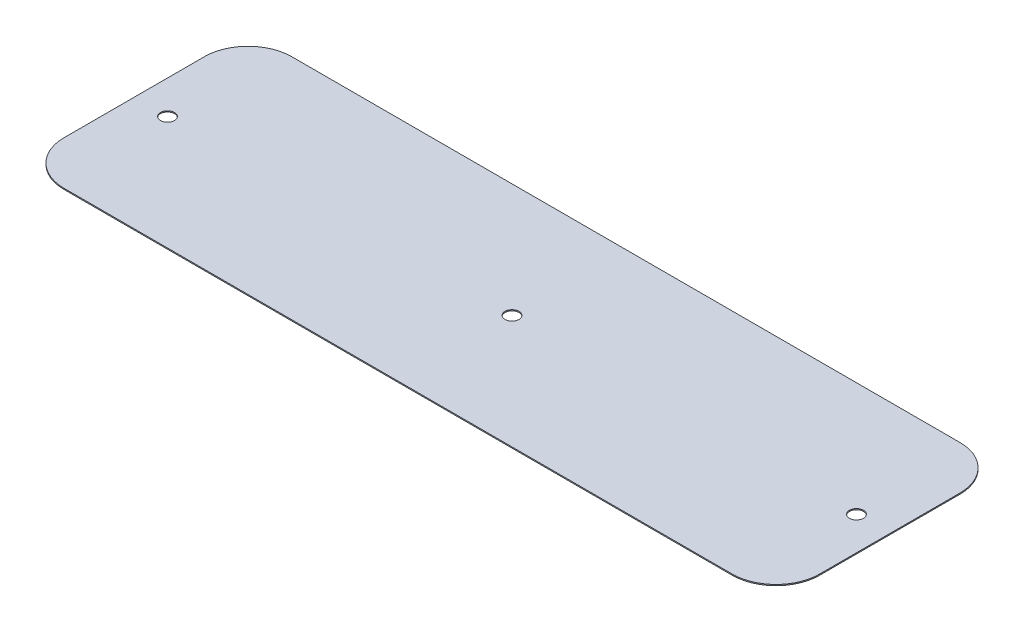
ISO-10303-21;
HEADER;
FILE_DESCRIPTION(('STEP AP214'),'2;1');
FILE_NAME('part.step','',(''),(''),'','','');
FILE_SCHEMA(('AUTOMOTIVE_DESIGN { 1 0 10303 214 1 1 1 1 }'));
ENDSEC;
DATA;
#1=APPLICATION_CONTEXT('core data for automotive mechanical design processes');
#2=APPLICATION_PROTOCOL_DEFINITION('international standard','automotive_design',2000,#1);
#3=PRODUCT_CONTEXT('',#1,'mechanical');
#4=PRODUCT('Part','Part','',(#3));
#5=PRODUCT_RELATED_PRODUCT_CATEGORY('part','',(#4));
#6=PRODUCT_DEFINITION_FORMATION('','',#4);
#7=PRODUCT_DEFINITION_CONTEXT('part definition',#1,'design');
#8=PRODUCT_DEFINITION('design','',#6,#7);
#9=PRODUCT_DEFINITION_SHAPE('','',#8);
#10=(LENGTH_UNIT() NAMED_UNIT(*) SI_UNIT(.MILLI.,.METRE.));
#11=(NAMED_UNIT(*) PLANE_ANGLE_UNIT() SI_UNIT($,.RADIAN.));
#12=(NAMED_UNIT(*) SI_UNIT($,.STERADIAN.) SOLID_ANGLE_UNIT());
#13=UNCERTAINTY_MEASURE_WITH_UNIT(LENGTH_MEASURE(1.E-05),#10,'distance_accuracy_value','');
#14=(GEOMETRIC_REPRESENTATION_CONTEXT(3) GLOBAL_UNCERTAINTY_ASSIGNED_CONTEXT((#13)) GLOBAL_UNIT_ASSIGNED_CONTEXT((#10,
#11,#12)) REPRESENTATION_CONTEXT('',''));
#15=CARTESIAN_POINT('',(0.,0.,0.));
#16=DIRECTION('',(0.,0.,1.));
#17=DIRECTION('',(1.,0.,0.));
#18=AXIS2_PLACEMENT_3D('',#15,#16,#17);
#19=CARTESIAN_POINT('',(0.,0.25,0.));
#20=DIRECTION('',(0.,-1.,0.));
#21=DIRECTION('',(0.,0.,-1.));
#22=AXIS2_PLACEMENT_3D('',#19,#20,#21);
#23=PLANE('',#22);
#24=CARTESIAN_POINT('',(-78.74,0.25,0.));
#25=DIRECTION('',(0.,1.,0.));
#26=DIRECTION('',(0.,0.,1.));
#27=AXIS2_PLACEMENT_3D('',#24,#25,#26);
#28=CIRCLE('',#27,1.60000000000001);
#29=CARTESIAN_POINT('',(-78.74,0.25,1.60000000000001));
#30=VERTEX_POINT('',#29);
#31=EDGE_CURVE('E194',#30,#30,#28,.T.);
#32=ORIENTED_EDGE('',*,*,#31,.F.);
#33=EDGE_LOOP('',(#32));
#34=FACE_BOUND('',#33,.T.);
#35=CARTESIAN_POINT('',(0.,0.25,0.));
#36=DIRECTION('',(0.,1.,0.));
#37=DIRECTION('',(0.,0.,1.));
#38=AXIS2_PLACEMENT_3D('',#35,#36,#37);
#39=CIRCLE('',#38,1.6);
#40=CARTESIAN_POINT('',(0.,0.25,1.6));
#41=VERTEX_POINT('',#40);
#42=EDGE_CURVE('E199',#41,#41,#39,.T.);
#43=ORIENTED_EDGE('',*,*,#42,.F.);
#44=EDGE_LOOP('',(#43));
#45=FACE_BOUND('',#44,.T.);
#46=DIRECTION('',(-1.,0.,0.));
#47=VECTOR('',#46,1.);
#48=CARTESIAN_POINT('',(-86.36,0.25,-26.035));
#49=LINE('',#48,#47);
#50=CARTESIAN_POINT('',(76.36,0.25,-26.035));
#51=VERTEX_POINT('',#50);
#52=CARTESIAN_POINT('',(-76.36,0.25,-26.035));
#53=VERTEX_POINT('',#52);
#54=EDGE_CURVE('E183',#51,#53,#49,.T.);
#55=ORIENTED_EDGE('',*,*,#54,.T.);
#56=CARTESIAN_POINT('',(-76.36,0.25,-16.035));
#57=DIRECTION('',(0.,-1.,0.));
#58=DIRECTION('',(0.,0.,-1.));
#59=AXIS2_PLACEMENT_3D('',#56,#57,#58);
#60=CIRCLE('',#59,10.);
#61=CARTESIAN_POINT('',(-86.36,0.25,-16.035));
#62=VERTEX_POINT('',#61);
#63=EDGE_CURVE('E161',#53,#62,#60,.F.);
#64=ORIENTED_EDGE('',*,*,#63,.T.);
#65=DIRECTION('',(0.,0.,1.));
#66=VECTOR('',#65,1.);
#67=CARTESIAN_POINT('',(-86.36,0.25,26.035));
#68=LINE('',#67,#66);
#69=CARTESIAN_POINT('',(-86.36,0.25,16.035));
#70=VERTEX_POINT('',#69);
#71=EDGE_CURVE('E131',#62,#70,#68,.T.);
#72=ORIENTED_EDGE('',*,*,#71,.T.);
#73=CARTESIAN_POINT('',(-76.36,0.25,16.035));
#74=DIRECTION('',(0.,-1.,0.));
#75=DIRECTION('',(0.,0.,-1.));
#76=AXIS2_PLACEMENT_3D('',#73,#74,#75);
#77=CIRCLE('',#76,10.);
#78=CARTESIAN_POINT('',(-76.36,0.25,26.035));
#79=VERTEX_POINT('',#78);
#80=EDGE_CURVE('E67',#70,#79,#77,.F.);
#81=ORIENTED_EDGE('',*,*,#80,.T.);
#82=DIRECTION('',(1.,0.,0.));
#83=VECTOR('',#82,1.);
#84=CARTESIAN_POINT('',(-86.36,0.25,26.035));
#85=LINE('',#84,#83);
#86=CARTESIAN_POINT('',(76.36,0.25,26.035));
#87=VERTEX_POINT('',#86);
#88=EDGE_CURVE('E147',#79,#87,#85,.T.);
#89=ORIENTED_EDGE('',*,*,#88,.T.);
#90=CARTESIAN_POINT('',(76.36,0.25,16.035));
#91=DIRECTION('',(0.,-1.,0.));
#92=DIRECTION('',(0.,0.,-1.));
#93=AXIS2_PLACEMENT_3D('',#90,#91,#92);
#94=CIRCLE('',#93,10.);
#95=CARTESIAN_POINT('',(86.36,0.25,16.035));
#96=VERTEX_POINT('',#95);
#97=EDGE_CURVE('E157',#87,#96,#94,.F.);
#98=ORIENTED_EDGE('',*,*,#97,.T.);
#99=DIRECTION('',(0.,0.,-1.));
#100=VECTOR('',#99,1.);
#101=CARTESIAN_POINT('',(86.36,0.25,26.035));
#102=LINE('',#101,#100);
#103=CARTESIAN_POINT('',(86.36,0.25,-16.035));
#104=VERTEX_POINT('',#103);
#105=EDGE_CURVE('E141',#96,#104,#102,.T.);
#106=ORIENTED_EDGE('',*,*,#105,.T.);
#107=CARTESIAN_POINT('',(76.36,0.25,-16.035));
#108=DIRECTION('',(0.,-1.,0.));
#109=DIRECTION('',(0.,0.,-1.));
#110=AXIS2_PLACEMENT_3D('',#107,#108,#109);
#111=CIRCLE('',#110,10.);
#112=EDGE_CURVE('E159',#104,#51,#111,.F.);
#113=ORIENTED_EDGE('',*,*,#112,.T.);
#114=EDGE_LOOP('',(#55,#64,#72,#81,#89,#98,#106,#113));
#115=FACE_BOUND('',#114,.T.);
#116=CARTESIAN_POINT('',(78.74,0.25,0.));
#117=DIRECTION('',(0.,-1.,0.));
#118=DIRECTION('',(0.,0.,1.));
#119=AXIS2_PLACEMENT_3D('',#116,#117,#118);
#120=CIRCLE('',#119,1.60000000000001);
#121=CARTESIAN_POINT('',(78.74,0.25,1.60000000000001));
#122=VERTEX_POINT('',#121);
#123=EDGE_CURVE('E202',#122,#122,#120,.T.);
#124=ORIENTED_EDGE('',*,*,#123,.T.);
#125=EDGE_LOOP('',(#124));
#126=FACE_BOUND('',#125,.T.);
#127=ADVANCED_FACE('F47',(#34,#45,#115,#126),#23,.F.);
#128=CARTESIAN_POINT('',(0.,0.,0.));
#129=DIRECTION('',(0.,-1.,0.));
#130=DIRECTION('',(0.,0.,-1.));
#131=AXIS2_PLACEMENT_3D('',#128,#129,#130);
#132=PLANE('',#131);
#133=DIRECTION('',(0.,0.,1.));
#134=VECTOR('',#133,1.);
#135=CARTESIAN_POINT('',(-86.36,0.,26.035));
#136=LINE('',#135,#134);
#137=CARTESIAN_POINT('',(-86.36,0.,-16.035));
#138=VERTEX_POINT('',#137);
#139=CARTESIAN_POINT('',(-86.36,0.,16.035));
#140=VERTEX_POINT('',#139);
#141=EDGE_CURVE('E129',#138,#140,#136,.T.);
#142=ORIENTED_EDGE('',*,*,#141,.F.);
#143=CARTESIAN_POINT('',(-76.36,0.,-16.035));
#144=DIRECTION('',(0.,-1.,0.));
#145=DIRECTION('',(0.,0.,-1.));
#146=AXIS2_PLACEMENT_3D('',#143,#144,#145);
#147=CIRCLE('',#146,10.);
#148=CARTESIAN_POINT('',(-76.36,0.,-26.035));
#149=VERTEX_POINT('',#148);
#150=EDGE_CURVE('E112',#138,#149,#147,.T.);
#151=ORIENTED_EDGE('',*,*,#150,.T.);
#152=DIRECTION('',(-1.,0.,0.));
#153=VECTOR('',#152,1.);
#154=CARTESIAN_POINT('',(-86.36,0.,-26.035));
#155=LINE('',#154,#153);
#156=CARTESIAN_POINT('',(76.36,0.,-26.035));
#157=VERTEX_POINT('',#156);
#158=EDGE_CURVE('E139',#157,#149,#155,.T.);
#159=ORIENTED_EDGE('',*,*,#158,.F.);
#160=CARTESIAN_POINT('',(76.36,0.,-16.035));
#161=DIRECTION('',(0.,-1.,0.));
#162=DIRECTION('',(0.,0.,-1.));
#163=AXIS2_PLACEMENT_3D('',#160,#161,#162);
#164=CIRCLE('',#163,10.);
#165=CARTESIAN_POINT('',(86.36,0.,-16.035));
#166=VERTEX_POINT('',#165);
#167=EDGE_CURVE('E123',#157,#166,#164,.T.);
#168=ORIENTED_EDGE('',*,*,#167,.T.);
#169=DIRECTION('',(0.,0.,-1.));
#170=VECTOR('',#169,1.);
#171=CARTESIAN_POINT('',(86.36,0.,26.035));
#172=LINE('',#171,#170);
#173=CARTESIAN_POINT('',(86.36,0.,16.035));
#174=VERTEX_POINT('',#173);
#175=EDGE_CURVE('E143',#174,#166,#172,.T.);
#176=ORIENTED_EDGE('',*,*,#175,.F.);
#177=CARTESIAN_POINT('',(76.36,0.,16.035));
#178=DIRECTION('',(0.,-1.,0.));
#179=DIRECTION('',(0.,0.,-1.));
#180=AXIS2_PLACEMENT_3D('',#177,#178,#179);
#181=CIRCLE('',#180,10.);
#182=CARTESIAN_POINT('',(76.36,0.,26.035));
#183=VERTEX_POINT('',#182);
#184=EDGE_CURVE('E150',#174,#183,#181,.T.);
#185=ORIENTED_EDGE('',*,*,#184,.T.);
#186=DIRECTION('',(1.,0.,0.));
#187=VECTOR('',#186,1.);
#188=CARTESIAN_POINT('',(-86.36,0.,26.035));
#189=LINE('',#188,#187);
#190=CARTESIAN_POINT('',(-76.36,0.,26.035));
#191=VERTEX_POINT('',#190);
#192=EDGE_CURVE('E138',#191,#183,#189,.T.);
#193=ORIENTED_EDGE('',*,*,#192,.F.);
#194=CARTESIAN_POINT('',(-76.36,0.,16.035));
#195=DIRECTION('',(0.,-1.,0.));
#196=DIRECTION('',(0.,0.,-1.));
#197=AXIS2_PLACEMENT_3D('',#194,#195,#196);
#198=CIRCLE('',#197,10.);
#199=EDGE_CURVE('E132',#191,#140,#198,.T.);
#200=ORIENTED_EDGE('',*,*,#199,.T.);
#201=EDGE_LOOP('',(#142,#151,#159,#168,#176,#185,#193,#200));
#202=FACE_BOUND('',#201,.T.);
#203=CARTESIAN_POINT('',(0.,0.,0.));
#204=DIRECTION('',(0.,1.,0.));
#205=DIRECTION('',(0.,0.,1.));
#206=AXIS2_PLACEMENT_3D('',#203,#204,#205);
#207=CIRCLE('',#206,1.6);
#208=CARTESIAN_POINT('',(0.,0.,1.6));
#209=VERTEX_POINT('',#208);
#210=EDGE_CURVE('E188',#209,#209,#207,.T.);
#211=ORIENTED_EDGE('',*,*,#210,.T.);
#212=EDGE_LOOP('',(#211));
#213=FACE_BOUND('',#212,.T.);
#214=CARTESIAN_POINT('',(-78.74,0.,0.));
#215=DIRECTION('',(0.,1.,0.));
#216=DIRECTION('',(0.,0.,1.));
#217=AXIS2_PLACEMENT_3D('',#214,#215,#216);
#218=CIRCLE('',#217,1.60000000000001);
#219=CARTESIAN_POINT('',(-78.74,0.,1.60000000000001));
#220=VERTEX_POINT('',#219);
#221=EDGE_CURVE('E192',#220,#220,#218,.T.);
#222=ORIENTED_EDGE('',*,*,#221,.T.);
#223=EDGE_LOOP('',(#222));
#224=FACE_BOUND('',#223,.T.);
#225=CARTESIAN_POINT('',(78.74,0.,0.));
#226=DIRECTION('',(0.,-1.,0.));
#227=DIRECTION('',(0.,0.,1.));
#228=AXIS2_PLACEMENT_3D('',#225,#226,#227);
#229=CIRCLE('',#228,1.60000000000001);
#230=CARTESIAN_POINT('',(78.74,0.,1.60000000000001));
#231=VERTEX_POINT('',#230);
#232=EDGE_CURVE('E208',#231,#231,#229,.T.);
#233=ORIENTED_EDGE('',*,*,#232,.F.);
#234=EDGE_LOOP('',(#233));
#235=FACE_BOUND('',#234,.T.);
#236=ADVANCED_FACE('F135',(#202,#213,#224,#235),#132,.T.);
#237=CARTESIAN_POINT('',(86.36,0.25,26.035));
#238=DIRECTION('',(-1.,0.,0.));
#239=DIRECTION('',(0.,0.,1.));
#240=AXIS2_PLACEMENT_3D('',#237,#238,#239);
#241=PLANE('',#240);
#242=ORIENTED_EDGE('',*,*,#175,.T.);
#243=DIRECTION('',(0.,-1.,0.));
#244=VECTOR('',#243,1.);
#245=CARTESIAN_POINT('',(86.36,0.25,-16.035));
#246=LINE('',#245,#244);
#247=EDGE_CURVE('E166',#166,#104,#246,.F.);
#248=ORIENTED_EDGE('',*,*,#247,.T.);
#249=ORIENTED_EDGE('',*,*,#105,.F.);
#250=DIRECTION('',(0.,-1.,0.));
#251=VECTOR('',#250,1.);
#252=CARTESIAN_POINT('',(86.36,0.25,16.035));
#253=LINE('',#252,#251);
#254=EDGE_CURVE('E163',#96,#174,#253,.T.);
#255=ORIENTED_EDGE('',*,*,#254,.T.);
#256=EDGE_LOOP('',(#242,#248,#249,#255));
#257=FACE_BOUND('',#256,.T.);
#258=ADVANCED_FACE('F179',(#257),#241,.F.);
#259=CARTESIAN_POINT('',(-86.36,0.25,-26.035));
#260=DIRECTION('',(0.,0.,1.));
#261=DIRECTION('',(1.,0.,0.));
#262=AXIS2_PLACEMENT_3D('',#259,#260,#261);
#263=PLANE('',#262);
#264=ORIENTED_EDGE('',*,*,#158,.T.);
#265=DIRECTION('',(0.,-1.,0.));
#266=VECTOR('',#265,1.);
#267=CARTESIAN_POINT('',(-76.36,0.25,-26.035));
#268=LINE('',#267,#266);
#269=EDGE_CURVE('E117',#149,#53,#268,.F.);
#270=ORIENTED_EDGE('',*,*,#269,.T.);
#271=ORIENTED_EDGE('',*,*,#54,.F.);
#272=DIRECTION('',(0.,-1.,0.));
#273=VECTOR('',#272,1.);
#274=CARTESIAN_POINT('',(76.36,0.25,-26.035));
#275=LINE('',#274,#273);
#276=EDGE_CURVE('E122',#51,#157,#275,.T.);
#277=ORIENTED_EDGE('',*,*,#276,.T.);
#278=EDGE_LOOP('',(#264,#270,#271,#277));
#279=FACE_BOUND('',#278,.T.);
#280=ADVANCED_FACE('F242',(#279),#263,.F.);
#281=CARTESIAN_POINT('',(-86.36,0.25,26.035));
#282=DIRECTION('',(1.,0.,0.));
#283=DIRECTION('',(0.,0.,-1.));
#284=AXIS2_PLACEMENT_3D('',#281,#282,#283);
#285=PLANE('',#284);
#286=ORIENTED_EDGE('',*,*,#71,.F.);
#287=DIRECTION('',(0.,-1.,0.));
#288=VECTOR('',#287,1.);
#289=CARTESIAN_POINT('',(-86.36,0.25,-16.035));
#290=LINE('',#289,#288);
#291=EDGE_CURVE('E116',#62,#138,#290,.T.);
#292=ORIENTED_EDGE('',*,*,#291,.T.);
#293=ORIENTED_EDGE('',*,*,#141,.T.);
#294=DIRECTION('',(0.,-1.,0.));
#295=VECTOR('',#294,1.);
#296=CARTESIAN_POINT('',(-86.36,0.25,16.035));
#297=LINE('',#296,#295);
#298=EDGE_CURVE('E133',#140,#70,#297,.F.);
#299=ORIENTED_EDGE('',*,*,#298,.T.);
#300=EDGE_LOOP('',(#286,#292,#293,#299));
#301=FACE_BOUND('',#300,.T.);
#302=ADVANCED_FACE('F128',(#301),#285,.F.);
#303=CARTESIAN_POINT('',(-86.36,0.25,26.035));
#304=DIRECTION('',(0.,0.,-1.));
#305=DIRECTION('',(-1.,0.,0.));
#306=AXIS2_PLACEMENT_3D('',#303,#304,#305);
#307=PLANE('',#306);
#308=ORIENTED_EDGE('',*,*,#192,.T.);
#309=DIRECTION('',(0.,-1.,0.));
#310=VECTOR('',#309,1.);
#311=CARTESIAN_POINT('',(76.36,0.25,26.035));
#312=LINE('',#311,#310);
#313=EDGE_CURVE('E11',#183,#87,#312,.F.);
#314=ORIENTED_EDGE('',*,*,#313,.T.);
#315=ORIENTED_EDGE('',*,*,#88,.F.);
#316=DIRECTION('',(0.,-1.,0.));
#317=VECTOR('',#316,1.);
#318=CARTESIAN_POINT('',(-76.36,0.25,26.035));
#319=LINE('',#318,#317);
#320=EDGE_CURVE('E55',#79,#191,#319,.T.);
#321=ORIENTED_EDGE('',*,*,#320,.T.);
#322=EDGE_LOOP('',(#308,#314,#315,#321));
#323=FACE_BOUND('',#322,.T.);
#324=ADVANCED_FACE('F169',(#323),#307,.F.);
#325=CARTESIAN_POINT('',(-76.36,0.25,-16.035));
#326=DIRECTION('',(0.,-1.,0.));
#327=DIRECTION('',(0.,0.,-1.));
#328=AXIS2_PLACEMENT_3D('',#325,#326,#327);
#329=CYLINDRICAL_SURFACE('',#328,10.);
#330=ORIENTED_EDGE('',*,*,#63,.F.);
#331=ORIENTED_EDGE('',*,*,#269,.F.);
#332=ORIENTED_EDGE('',*,*,#150,.F.);
#333=ORIENTED_EDGE('',*,*,#291,.F.);
#334=EDGE_LOOP('',(#330,#331,#332,#333));
#335=FACE_BOUND('',#334,.T.);
#336=ADVANCED_FACE('F115',(#335),#329,.T.);
#337=CARTESIAN_POINT('',(76.36,0.25,-16.035));
#338=DIRECTION('',(0.,-1.,0.));
#339=DIRECTION('',(0.,0.,-1.));
#340=AXIS2_PLACEMENT_3D('',#337,#338,#339);
#341=CYLINDRICAL_SURFACE('',#340,10.);
#342=ORIENTED_EDGE('',*,*,#112,.F.);
#343=ORIENTED_EDGE('',*,*,#247,.F.);
#344=ORIENTED_EDGE('',*,*,#167,.F.);
#345=ORIENTED_EDGE('',*,*,#276,.F.);
#346=EDGE_LOOP('',(#342,#343,#344,#345));
#347=FACE_BOUND('',#346,.T.);
#348=ADVANCED_FACE('F250',(#347),#341,.T.);
#349=CARTESIAN_POINT('',(76.36,0.25,16.035));
#350=DIRECTION('',(0.,-1.,0.));
#351=DIRECTION('',(0.,0.,-1.));
#352=AXIS2_PLACEMENT_3D('',#349,#350,#351);
#353=CYLINDRICAL_SURFACE('',#352,10.);
#354=ORIENTED_EDGE('',*,*,#97,.F.);
#355=ORIENTED_EDGE('',*,*,#313,.F.);
#356=ORIENTED_EDGE('',*,*,#184,.F.);
#357=ORIENTED_EDGE('',*,*,#254,.F.);
#358=EDGE_LOOP('',(#354,#355,#356,#357));
#359=FACE_BOUND('',#358,.T.);
#360=ADVANCED_FACE('F176',(#359),#353,.T.);
#361=CARTESIAN_POINT('',(-76.36,0.25,16.035));
#362=DIRECTION('',(0.,-1.,0.));
#363=DIRECTION('',(0.,0.,-1.));
#364=AXIS2_PLACEMENT_3D('',#361,#362,#363);
#365=CYLINDRICAL_SURFACE('',#364,10.);
#366=ORIENTED_EDGE('',*,*,#80,.F.);
#367=ORIENTED_EDGE('',*,*,#298,.F.);
#368=ORIENTED_EDGE('',*,*,#199,.F.);
#369=ORIENTED_EDGE('',*,*,#320,.F.);
#370=EDGE_LOOP('',(#366,#367,#368,#369));
#371=FACE_BOUND('',#370,.T.);
#372=ADVANCED_FACE('F49',(#371),#365,.T.);
#373=CARTESIAN_POINT('',(0.,0.,0.));
#374=DIRECTION('',(0.,1.,0.));
#375=DIRECTION('',(0.,0.,1.));
#376=AXIS2_PLACEMENT_3D('',#373,#374,#375);
#377=CYLINDRICAL_SURFACE('',#376,1.6);
#378=ORIENTED_EDGE('',*,*,#210,.F.);
#379=EDGE_LOOP('',(#378));
#380=FACE_BOUND('',#379,.T.);
#381=ORIENTED_EDGE('',*,*,#42,.T.);
#382=EDGE_LOOP('',(#381));
#383=FACE_BOUND('',#382,.T.);
#384=ADVANCED_FACE('F224',(#380,#383),#377,.F.);
#385=CARTESIAN_POINT('',(-78.74,0.,0.));
#386=DIRECTION('',(0.,1.,0.));
#387=DIRECTION('',(0.,0.,1.));
#388=AXIS2_PLACEMENT_3D('',#385,#386,#387);
#389=CYLINDRICAL_SURFACE('',#388,1.60000000000001);
#390=ORIENTED_EDGE('',*,*,#221,.F.);
#391=EDGE_LOOP('',(#390));
#392=FACE_BOUND('',#391,.T.);
#393=ORIENTED_EDGE('',*,*,#31,.T.);
#394=EDGE_LOOP('',(#393));
#395=FACE_BOUND('',#394,.T.);
#396=ADVANCED_FACE('F219',(#392,#395),#389,.F.);
#397=CARTESIAN_POINT('',(78.74,0.,0.));
#398=DIRECTION('',(0.,1.,0.));
#399=DIRECTION('',(0.,0.,1.));
#400=AXIS2_PLACEMENT_3D('',#397,#398,#399);
#401=CYLINDRICAL_SURFACE('',#400,1.60000000000001);
#402=ORIENTED_EDGE('',*,*,#232,.T.);
#403=EDGE_LOOP('',(#402));
#404=FACE_BOUND('',#403,.T.);
#405=ORIENTED_EDGE('',*,*,#123,.F.);
#406=EDGE_LOOP('',(#405));
#407=FACE_BOUND('',#406,.T.);
#408=ADVANCED_FACE('F217',(#404,#407),#401,.F.);
#409=CLOSED_SHELL('',(#127,#236,#258,#280,#302,#324,#336,#348,#360,#372,#384,#396,#408));
#410=MANIFOLD_SOLID_BREP('B2',#409);
#411=ADVANCED_BREP_SHAPE_REPRESENTATION('',(#18,#410),#14);
#412=SHAPE_DEFINITION_REPRESENTATION(#9,#411);
ENDSEC;
END-ISO-10303-21;
